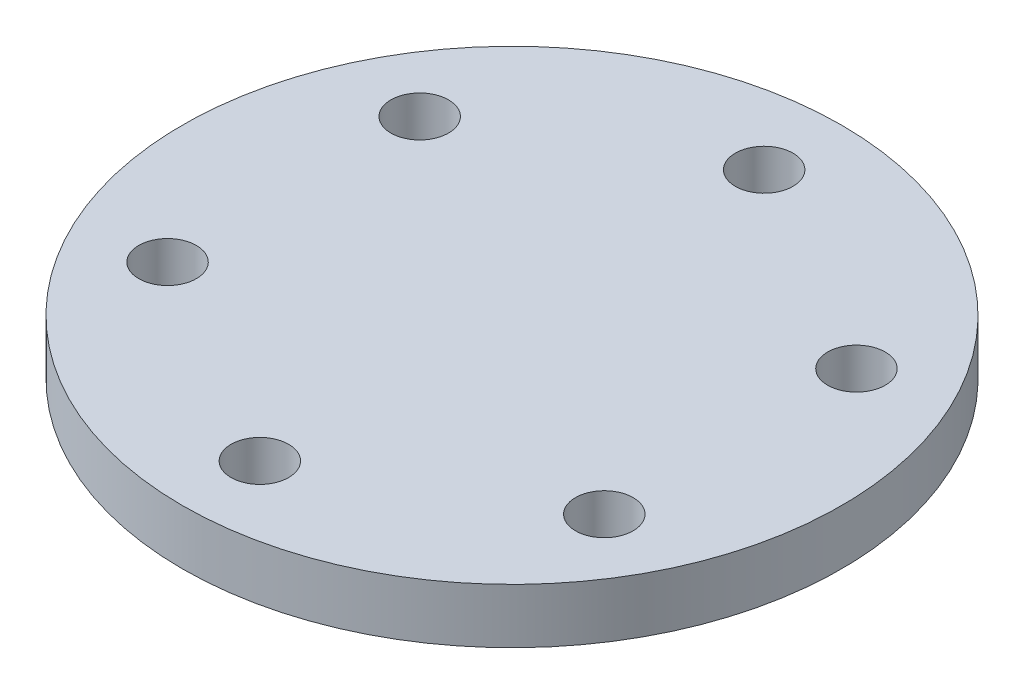
ISO-10303-21;
HEADER;
FILE_DESCRIPTION(('STEP AP214'),'2;1');
FILE_NAME('part.step','',(''),(''),'','','');
FILE_SCHEMA(('AUTOMOTIVE_DESIGN { 1 0 10303 214 1 1 1 1 }'));
ENDSEC;
DATA;
#1=APPLICATION_CONTEXT('core data for automotive mechanical design processes');
#2=APPLICATION_PROTOCOL_DEFINITION('international standard','automotive_design',2000,#1);
#3=PRODUCT_CONTEXT('',#1,'mechanical');
#4=PRODUCT('Part','Part','',(#3));
#5=PRODUCT_RELATED_PRODUCT_CATEGORY('part','',(#4));
#6=PRODUCT_DEFINITION_FORMATION('','',#4);
#7=PRODUCT_DEFINITION_CONTEXT('part definition',#1,'design');
#8=PRODUCT_DEFINITION('design','',#6,#7);
#9=PRODUCT_DEFINITION_SHAPE('','',#8);
#10=(LENGTH_UNIT() NAMED_UNIT(*) SI_UNIT(.MILLI.,.METRE.));
#11=(NAMED_UNIT(*) PLANE_ANGLE_UNIT() SI_UNIT($,.RADIAN.));
#12=(NAMED_UNIT(*) SI_UNIT($,.STERADIAN.) SOLID_ANGLE_UNIT());
#13=UNCERTAINTY_MEASURE_WITH_UNIT(LENGTH_MEASURE(1.E-05),#10,'distance_accuracy_value','');
#14=(GEOMETRIC_REPRESENTATION_CONTEXT(3) GLOBAL_UNCERTAINTY_ASSIGNED_CONTEXT((#13)) GLOBAL_UNIT_ASSIGNED_CONTEXT((#10,
#11,#12)) REPRESENTATION_CONTEXT('',''));
#15=CARTESIAN_POINT('',(0.,0.,0.));
#16=DIRECTION('',(0.,0.,1.));
#17=DIRECTION('',(1.,0.,0.));
#18=AXIS2_PLACEMENT_3D('',#15,#16,#17);
#19=CARTESIAN_POINT('',(0.,10.,0.));
#20=DIRECTION('',(0.,-1.,0.));
#21=DIRECTION('',(0.,0.,-1.));
#22=AXIS2_PLACEMENT_3D('',#19,#20,#21);
#23=CYLINDRICAL_SURFACE('',#22,60.0888174706087);
#24=CARTESIAN_POINT('',(0.,10.,0.));
#25=DIRECTION('',(0.,1.,0.));
#26=DIRECTION('',(0.,0.,1.));
#27=AXIS2_PLACEMENT_3D('',#24,#25,#26);
#28=CIRCLE('',#27,60.0888174706087);
#29=CARTESIAN_POINT('',(0.,10.,60.0888174706087));
#30=VERTEX_POINT('',#29);
#31=EDGE_CURVE('E10',#30,#30,#28,.T.);
#32=ORIENTED_EDGE('',*,*,#31,.F.);
#33=EDGE_LOOP('',(#32));
#34=FACE_BOUND('',#33,.T.);
#35=CARTESIAN_POINT('',(0.,0.,0.));
#36=DIRECTION('',(0.,1.,0.));
#37=DIRECTION('',(0.,0.,1.));
#38=AXIS2_PLACEMENT_3D('',#35,#36,#37);
#39=CIRCLE('',#38,60.0888174706087);
#40=CARTESIAN_POINT('',(0.,0.,60.0888174706087));
#41=VERTEX_POINT('',#40);
#42=EDGE_CURVE('E37',#41,#41,#39,.T.);
#43=ORIENTED_EDGE('',*,*,#42,.T.);
#44=EDGE_LOOP('',(#43));
#45=FACE_BOUND('',#44,.T.);
#46=ADVANCED_FACE('F40',(#34,#45),#23,.T.);
#47=CARTESIAN_POINT('',(0.,10.,0.));
#48=DIRECTION('',(0.,1.,0.));
#49=DIRECTION('',(0.,0.,1.));
#50=AXIS2_PLACEMENT_3D('',#47,#48,#49);
#51=PLANE('',#50);
#52=CARTESIAN_POINT('',(39.8172146980742,10.,-22.9884796243149));
#53=DIRECTION('',(0.,1.,0.));
#54=DIRECTION('',(-0.866025403784433,0.,0.50000000000001));
#55=AXIS2_PLACEMENT_3D('',#52,#53,#54);
#56=CIRCLE('',#55,5.25512509875522);
#57=CARTESIAN_POINT('',(35.266142862487,10.,-20.3609170749372));
#58=VERTEX_POINT('',#57);
#59=EDGE_CURVE('E61',#58,#58,#56,.T.);
#60=ORIENTED_EDGE('',*,*,#59,.F.);
#61=EDGE_LOOP('',(#60));
#62=FACE_BOUND('',#61,.T.);
#63=CARTESIAN_POINT('',(39.8172146980746,10.,22.988479624314));
#64=DIRECTION('',(0.,1.,0.));
#65=DIRECTION('',(-0.866025403784443,0.,-0.499999999999992));
#66=AXIS2_PLACEMENT_3D('',#63,#64,#65);
#67=CIRCLE('',#66,5.25512509875522);
#68=CARTESIAN_POINT('',(35.2661428624874,10.,20.3609170749365));
#69=VERTEX_POINT('',#68);
#70=EDGE_CURVE('E69',#69,#69,#67,.T.);
#71=ORIENTED_EDGE('',*,*,#70,.F.);
#72=EDGE_LOOP('',(#71));
#73=FACE_BOUND('',#72,.T.);
#74=CARTESIAN_POINT('',(0.,10.,45.9769592486288));
#75=DIRECTION('',(0.,1.,0.));
#76=DIRECTION('',(0.,0.,-1.));
#77=AXIS2_PLACEMENT_3D('',#74,#75,#76);
#78=CIRCLE('',#77,5.25512509875522);
#79=CARTESIAN_POINT('',(0.,10.,40.7218341498736));
#80=VERTEX_POINT('',#79);
#81=EDGE_CURVE('E77',#80,#80,#78,.T.);
#82=ORIENTED_EDGE('',*,*,#81,.F.);
#83=EDGE_LOOP('',(#82));
#84=FACE_BOUND('',#83,.T.);
#85=CARTESIAN_POINT('',(-39.8172146980743,10.,22.9884796243146));
#86=DIRECTION('',(0.,1.,0.));
#87=DIRECTION('',(0.866025403784436,0.,-0.500000000000004));
#88=AXIS2_PLACEMENT_3D('',#85,#86,#87);
#89=CIRCLE('',#88,5.25512509875522);
#90=CARTESIAN_POINT('',(-35.2661428624871,10.,20.3609170749369));
#91=VERTEX_POINT('',#90);
#92=EDGE_CURVE('E59',#91,#91,#89,.T.);
#93=ORIENTED_EDGE('',*,*,#92,.F.);
#94=EDGE_LOOP('',(#93));
#95=FACE_BOUND('',#94,.T.);
#96=CARTESIAN_POINT('',(-39.8172146980745,10.,-22.9884796243143));
#97=DIRECTION('',(0.,1.,0.));
#98=DIRECTION('',(0.86602540378444,0.,0.499999999999998));
#99=AXIS2_PLACEMENT_3D('',#96,#97,#98);
#100=CIRCLE('',#99,5.25512509875522);
#101=CARTESIAN_POINT('',(-35.2661428624872,10.,-20.3609170749367));
#102=VERTEX_POINT('',#101);
#103=EDGE_CURVE('E55',#102,#102,#100,.T.);
#104=ORIENTED_EDGE('',*,*,#103,.F.);
#105=EDGE_LOOP('',(#104));
#106=FACE_BOUND('',#105,.T.);
#107=CARTESIAN_POINT('',(0.,10.,-45.9769592486288));
#108=DIRECTION('',(0.,1.,0.));
#109=DIRECTION('',(0.,0.,1.));
#110=AXIS2_PLACEMENT_3D('',#107,#108,#109);
#111=CIRCLE('',#110,5.25512509875522);
#112=CARTESIAN_POINT('',(0.,10.,-40.7218341498736));
#113=VERTEX_POINT('',#112);
#114=EDGE_CURVE('E50',#113,#113,#111,.T.);
#115=ORIENTED_EDGE('',*,*,#114,.F.);
#116=EDGE_LOOP('',(#115));
#117=FACE_BOUND('',#116,.T.);
#118=ORIENTED_EDGE('',*,*,#31,.T.);
#119=EDGE_LOOP('',(#118));
#120=FACE_BOUND('',#119,.T.);
#121=ADVANCED_FACE('F86',(#62,#73,#84,#95,#106,#117,#120),#51,.T.);
#122=CARTESIAN_POINT('',(0.,0.,0.));
#123=DIRECTION('',(0.,1.,0.));
#124=DIRECTION('',(0.,0.,1.));
#125=AXIS2_PLACEMENT_3D('',#122,#123,#124);
#126=PLANE('',#125);
#127=CARTESIAN_POINT('',(39.8172146980742,0.,-22.9884796243149));
#128=DIRECTION('',(0.,1.,0.));
#129=DIRECTION('',(-0.866025403784433,0.,0.50000000000001));
#130=AXIS2_PLACEMENT_3D('',#127,#128,#129);
#131=CIRCLE('',#130,5.25512509875522);
#132=CARTESIAN_POINT('',(35.266142862487,0.,-20.3609170749372));
#133=VERTEX_POINT('',#132);
#134=EDGE_CURVE('E62',#133,#133,#131,.T.);
#135=ORIENTED_EDGE('',*,*,#134,.T.);
#136=EDGE_LOOP('',(#135));
#137=FACE_BOUND('',#136,.T.);
#138=CARTESIAN_POINT('',(39.8172146980746,0.,22.988479624314));
#139=DIRECTION('',(0.,1.,0.));
#140=DIRECTION('',(-0.866025403784443,0.,-0.499999999999992));
#141=AXIS2_PLACEMENT_3D('',#138,#139,#140);
#142=CIRCLE('',#141,5.25512509875522);
#143=CARTESIAN_POINT('',(35.2661428624874,0.,20.3609170749365));
#144=VERTEX_POINT('',#143);
#145=EDGE_CURVE('E70',#144,#144,#142,.T.);
#146=ORIENTED_EDGE('',*,*,#145,.T.);
#147=EDGE_LOOP('',(#146));
#148=FACE_BOUND('',#147,.T.);
#149=CARTESIAN_POINT('',(0.,0.,45.9769592486288));
#150=DIRECTION('',(0.,1.,0.));
#151=DIRECTION('',(0.,0.,-1.));
#152=AXIS2_PLACEMENT_3D('',#149,#150,#151);
#153=CIRCLE('',#152,5.25512509875522);
#154=CARTESIAN_POINT('',(0.,0.,40.7218341498736));
#155=VERTEX_POINT('',#154);
#156=EDGE_CURVE('E71',#155,#155,#153,.T.);
#157=ORIENTED_EDGE('',*,*,#156,.T.);
#158=EDGE_LOOP('',(#157));
#159=FACE_BOUND('',#158,.T.);
#160=CARTESIAN_POINT('',(-39.8172146980743,0.,22.9884796243146));
#161=DIRECTION('',(0.,1.,0.));
#162=DIRECTION('',(0.866025403784436,0.,-0.500000000000004));
#163=AXIS2_PLACEMENT_3D('',#160,#161,#162);
#164=CIRCLE('',#163,5.25512509875522);
#165=CARTESIAN_POINT('',(-35.2661428624871,0.,20.3609170749369));
#166=VERTEX_POINT('',#165);
#167=EDGE_CURVE('E76',#166,#166,#164,.T.);
#168=ORIENTED_EDGE('',*,*,#167,.T.);
#169=EDGE_LOOP('',(#168));
#170=FACE_BOUND('',#169,.T.);
#171=CARTESIAN_POINT('',(-39.8172146980745,0.,-22.9884796243143));
#172=DIRECTION('',(0.,1.,0.));
#173=DIRECTION('',(0.86602540378444,0.,0.499999999999998));
#174=AXIS2_PLACEMENT_3D('',#171,#172,#173);
#175=CIRCLE('',#174,5.25512509875522);
#176=CARTESIAN_POINT('',(-35.2661428624872,0.,-20.3609170749367));
#177=VERTEX_POINT('',#176);
#178=EDGE_CURVE('E54',#177,#177,#175,.T.);
#179=ORIENTED_EDGE('',*,*,#178,.T.);
#180=EDGE_LOOP('',(#179));
#181=FACE_BOUND('',#180,.T.);
#182=CARTESIAN_POINT('',(0.,0.,-45.9769592486288));
#183=DIRECTION('',(0.,1.,0.));
#184=DIRECTION('',(0.,0.,1.));
#185=AXIS2_PLACEMENT_3D('',#182,#183,#184);
#186=CIRCLE('',#185,5.25512509875522);
#187=CARTESIAN_POINT('',(0.,0.,-40.7218341498736));
#188=VERTEX_POINT('',#187);
#189=EDGE_CURVE('E47',#188,#188,#186,.T.);
#190=ORIENTED_EDGE('',*,*,#189,.T.);
#191=EDGE_LOOP('',(#190));
#192=FACE_BOUND('',#191,.T.);
#193=ORIENTED_EDGE('',*,*,#42,.F.);
#194=EDGE_LOOP('',(#193));
#195=FACE_BOUND('',#194,.T.);
#196=ADVANCED_FACE('F93',(#137,#148,#159,#170,#181,#192,#195),#126,.F.);
#197=CARTESIAN_POINT('',(0.,10.,-45.9769592486288));
#198=DIRECTION('',(0.,-1.,0.));
#199=DIRECTION('',(0.,0.,-1.));
#200=AXIS2_PLACEMENT_3D('',#197,#198,#199);
#201=CYLINDRICAL_SURFACE('',#200,5.25512509875522);
#202=ORIENTED_EDGE('',*,*,#114,.T.);
#203=EDGE_LOOP('',(#202));
#204=FACE_BOUND('',#203,.T.);
#205=ORIENTED_EDGE('',*,*,#189,.F.);
#206=EDGE_LOOP('',(#205));
#207=FACE_BOUND('',#206,.T.);
#208=ADVANCED_FACE('F98',(#204,#207),#201,.F.);
#209=CARTESIAN_POINT('',(-39.8172146980745,10.,-22.9884796243143));
#210=DIRECTION('',(0.,-1.,0.));
#211=DIRECTION('',(0.,0.,-1.));
#212=AXIS2_PLACEMENT_3D('',#209,#210,#211);
#213=CYLINDRICAL_SURFACE('',#212,5.25512509875522);
#214=ORIENTED_EDGE('',*,*,#103,.T.);
#215=EDGE_LOOP('',(#214));
#216=FACE_BOUND('',#215,.T.);
#217=ORIENTED_EDGE('',*,*,#178,.F.);
#218=EDGE_LOOP('',(#217));
#219=FACE_BOUND('',#218,.T.);
#220=ADVANCED_FACE('F101',(#216,#219),#213,.F.);
#221=CARTESIAN_POINT('',(-39.8172146980743,10.,22.9884796243146));
#222=DIRECTION('',(0.,-1.,0.));
#223=DIRECTION('',(0.,0.,-1.));
#224=AXIS2_PLACEMENT_3D('',#221,#222,#223);
#225=CYLINDRICAL_SURFACE('',#224,5.25512509875522);
#226=ORIENTED_EDGE('',*,*,#92,.T.);
#227=EDGE_LOOP('',(#226));
#228=FACE_BOUND('',#227,.T.);
#229=ORIENTED_EDGE('',*,*,#167,.F.);
#230=EDGE_LOOP('',(#229));
#231=FACE_BOUND('',#230,.T.);
#232=ADVANCED_FACE('F84',(#228,#231),#225,.F.);
#233=CARTESIAN_POINT('',(0.,10.,45.9769592486288));
#234=DIRECTION('',(0.,-1.,0.));
#235=DIRECTION('',(0.,0.,-1.));
#236=AXIS2_PLACEMENT_3D('',#233,#234,#235);
#237=CYLINDRICAL_SURFACE('',#236,5.25512509875522);
#238=ORIENTED_EDGE('',*,*,#81,.T.);
#239=EDGE_LOOP('',(#238));
#240=FACE_BOUND('',#239,.T.);
#241=ORIENTED_EDGE('',*,*,#156,.F.);
#242=EDGE_LOOP('',(#241));
#243=FACE_BOUND('',#242,.T.);
#244=ADVANCED_FACE('F145',(#240,#243),#237,.F.);
#245=CARTESIAN_POINT('',(39.8172146980746,10.,22.988479624314));
#246=DIRECTION('',(0.,-1.,0.));
#247=DIRECTION('',(0.,0.,-1.));
#248=AXIS2_PLACEMENT_3D('',#245,#246,#247);
#249=CYLINDRICAL_SURFACE('',#248,5.25512509875522);
#250=ORIENTED_EDGE('',*,*,#70,.T.);
#251=EDGE_LOOP('',(#250));
#252=FACE_BOUND('',#251,.T.);
#253=ORIENTED_EDGE('',*,*,#145,.F.);
#254=EDGE_LOOP('',(#253));
#255=FACE_BOUND('',#254,.T.);
#256=ADVANCED_FACE('F155',(#252,#255),#249,.F.);
#257=CARTESIAN_POINT('',(39.8172146980742,10.,-22.9884796243149));
#258=DIRECTION('',(0.,-1.,0.));
#259=DIRECTION('',(0.,0.,-1.));
#260=AXIS2_PLACEMENT_3D('',#257,#258,#259);
#261=CYLINDRICAL_SURFACE('',#260,5.25512509875522);
#262=ORIENTED_EDGE('',*,*,#59,.T.);
#263=EDGE_LOOP('',(#262));
#264=FACE_BOUND('',#263,.T.);
#265=ORIENTED_EDGE('',*,*,#134,.F.);
#266=EDGE_LOOP('',(#265));
#267=FACE_BOUND('',#266,.T.);
#268=ADVANCED_FACE('F161',(#264,#267),#261,.F.);
#269=CLOSED_SHELL('',(#46,#121,#196,#208,#220,#232,#244,#256,#268));
#270=MANIFOLD_SOLID_BREP('B2',#269);
#271=ADVANCED_BREP_SHAPE_REPRESENTATION('',(#18,#270),#14);
#272=SHAPE_DEFINITION_REPRESENTATION(#9,#271);
ENDSEC;
END-ISO-10303-21;
